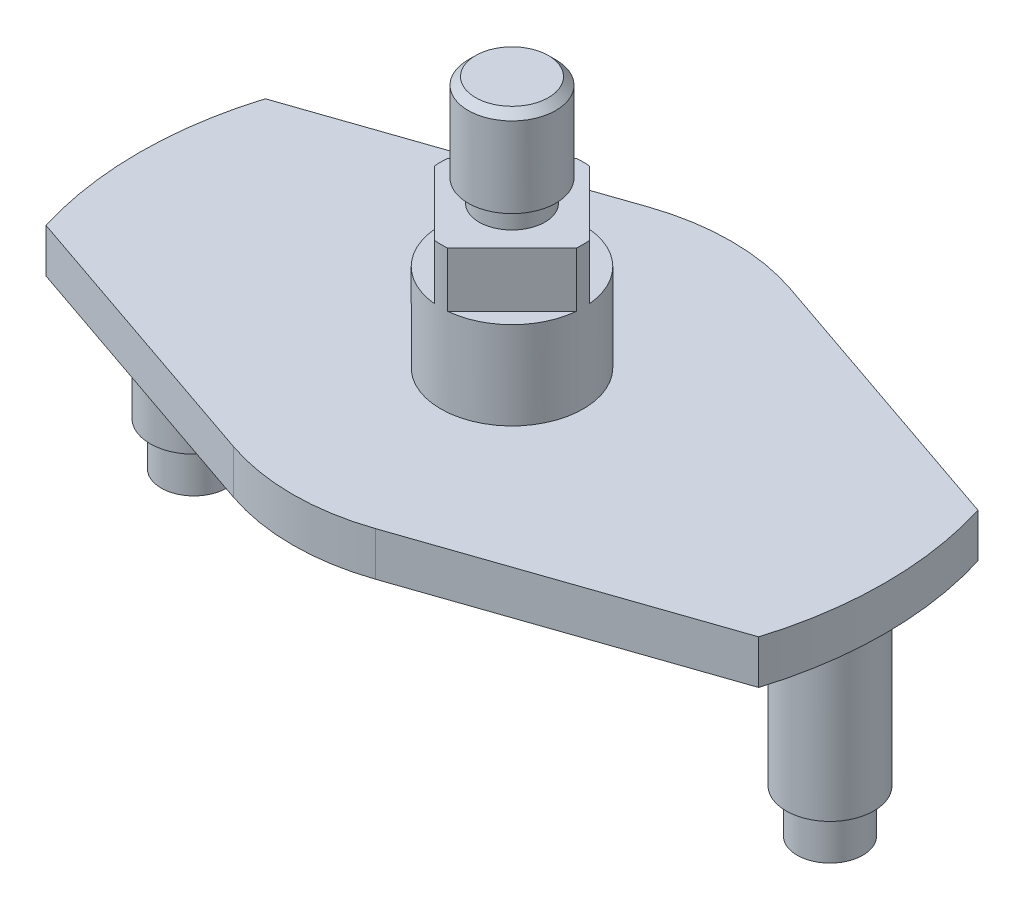
ISO-10303-21;
HEADER;
FILE_DESCRIPTION(('STEP AP214'),'2;1');
FILE_NAME('part.step','',(''),(''),'','','');
FILE_SCHEMA(('AUTOMOTIVE_DESIGN { 1 0 10303 214 1 1 1 1 }'));
ENDSEC;
DATA;
#1=APPLICATION_CONTEXT('core data for automotive mechanical design processes');
#2=APPLICATION_PROTOCOL_DEFINITION('international standard','automotive_design',2000,#1);
#3=PRODUCT_CONTEXT('',#1,'mechanical');
#4=PRODUCT('Part','Part','',(#3));
#5=PRODUCT_RELATED_PRODUCT_CATEGORY('part','',(#4));
#6=PRODUCT_DEFINITION_FORMATION('','',#4);
#7=PRODUCT_DEFINITION_CONTEXT('part definition',#1,'design');
#8=PRODUCT_DEFINITION('design','',#6,#7);
#9=PRODUCT_DEFINITION_SHAPE('','',#8);
#10=(LENGTH_UNIT() NAMED_UNIT(*) SI_UNIT(.MILLI.,.METRE.));
#11=(NAMED_UNIT(*) PLANE_ANGLE_UNIT() SI_UNIT($,.RADIAN.));
#12=(NAMED_UNIT(*) SI_UNIT($,.STERADIAN.) SOLID_ANGLE_UNIT());
#13=UNCERTAINTY_MEASURE_WITH_UNIT(LENGTH_MEASURE(1.E-05),#10,'distance_accuracy_value','');
#14=(GEOMETRIC_REPRESENTATION_CONTEXT(3) GLOBAL_UNCERTAINTY_ASSIGNED_CONTEXT((#13)) GLOBAL_UNIT_ASSIGNED_CONTEXT((#10,
#11,#12)) REPRESENTATION_CONTEXT('',''));
#15=CARTESIAN_POINT('',(0.,0.,0.));
#16=DIRECTION('',(0.,0.,1.));
#17=DIRECTION('',(1.,0.,0.));
#18=AXIS2_PLACEMENT_3D('',#15,#16,#17);
#19=CARTESIAN_POINT('',(29.,-18.5,0.));
#20=DIRECTION('',(0.,1.,0.));
#21=DIRECTION('',(0.,0.,1.));
#22=AXIS2_PLACEMENT_3D('',#19,#20,#21);
#23=CYLINDRICAL_SURFACE('',#22,4.);
#24=CARTESIAN_POINT('',(29.,0.,0.));
#25=DIRECTION('',(0.,1.,0.));
#26=DIRECTION('',(0.,0.,1.));
#27=AXIS2_PLACEMENT_3D('',#24,#25,#26);
#28=CIRCLE('',#27,4.);
#29=CARTESIAN_POINT('',(29.,0.,4.));
#30=VERTEX_POINT('',#29);
#31=EDGE_CURVE('E56',#30,#30,#28,.F.);
#32=ORIENTED_EDGE('',*,*,#31,.T.);
#33=EDGE_LOOP('',(#32));
#34=FACE_BOUND('',#33,.T.);
#35=CARTESIAN_POINT('',(29.,-14.5,0.));
#36=DIRECTION('',(0.,-1.,0.));
#37=DIRECTION('',(0.,0.,-1.));
#38=AXIS2_PLACEMENT_3D('',#35,#36,#37);
#39=CIRCLE('',#38,4.);
#40=CARTESIAN_POINT('',(29.,-14.5,-4.));
#41=VERTEX_POINT('',#40);
#42=EDGE_CURVE('E314',#41,#41,#39,.T.);
#43=ORIENTED_EDGE('',*,*,#42,.F.);
#44=EDGE_LOOP('',(#43));
#45=FACE_BOUND('',#44,.T.);
#46=ADVANCED_FACE('F48',(#34,#45),#23,.T.);
#47=CARTESIAN_POINT('',(0.,17.,0.));
#48=DIRECTION('',(0.,-1.,0.));
#49=DIRECTION('',(0.,0.,-1.));
#50=AXIS2_PLACEMENT_3D('',#47,#48,#49);
#51=CYLINDRICAL_SURFACE('',#50,6.5);
#52=CARTESIAN_POINT('',(0.,4.,0.));
#53=DIRECTION('',(0.,1.,0.));
#54=DIRECTION('',(0.,0.,1.));
#55=AXIS2_PLACEMENT_3D('',#52,#53,#54);
#56=CIRCLE('',#55,6.5);
#57=CARTESIAN_POINT('',(0.,4.,6.5));
#58=VERTEX_POINT('',#57);
#59=EDGE_CURVE('E190',#58,#58,#56,.T.);
#60=ORIENTED_EDGE('',*,*,#59,.T.);
#61=EDGE_LOOP('',(#60));
#62=FACE_BOUND('',#61,.T.);
#63=DIRECTION('',(0.,-1.,0.));
#64=VECTOR('',#63,1.);
#65=CARTESIAN_POINT('',(-6.47236893705042,17.,0.598698874815058));
#66=LINE('',#65,#64);
#67=CARTESIAN_POINT('',(-6.47236893705042,17.,0.598698874815055));
#68=VERTEX_POINT('',#67);
#69=CARTESIAN_POINT('',(-6.47236893705042,12.,0.598698874815055));
#70=VERTEX_POINT('',#69);
#71=EDGE_CURVE('E215',#68,#70,#66,.T.);
#72=ORIENTED_EDGE('',*,*,#71,.F.);
#73=CARTESIAN_POINT('',(0.,17.,0.));
#74=DIRECTION('',(0.,1.,0.));
#75=DIRECTION('',(0.,0.,1.));
#76=AXIS2_PLACEMENT_3D('',#73,#74,#75);
#77=CIRCLE('',#76,6.5);
#78=CARTESIAN_POINT('',(-6.47236893705042,17.,-0.598698874815054));
#79=VERTEX_POINT('',#78);
#80=EDGE_CURVE('E189',#79,#68,#77,.T.);
#81=ORIENTED_EDGE('',*,*,#80,.F.);
#82=DIRECTION('',(0.,-1.,0.));
#83=VECTOR('',#82,1.);
#84=CARTESIAN_POINT('',(-6.47236893705042,17.,-0.598698874815055));
#85=LINE('',#84,#83);
#86=CARTESIAN_POINT('',(-6.47236893705042,12.,-0.598698874815055));
#87=VERTEX_POINT('',#86);
#88=EDGE_CURVE('E71',#87,#79,#85,.F.);
#89=ORIENTED_EDGE('',*,*,#88,.F.);
#90=CARTESIAN_POINT('',(0.,12.,0.));
#91=DIRECTION('',(0.,1.,0.));
#92=DIRECTION('',(0.,0.,1.));
#93=AXIS2_PLACEMENT_3D('',#90,#91,#92);
#94=CIRCLE('',#93,6.5);
#95=CARTESIAN_POINT('',(-0.598698874815049,12.,-6.47236893705042));
#96=VERTEX_POINT('',#95);
#97=EDGE_CURVE('E212',#96,#87,#94,.T.);
#98=ORIENTED_EDGE('',*,*,#97,.F.);
#99=DIRECTION('',(0.,-1.,0.));
#100=VECTOR('',#99,1.);
#101=CARTESIAN_POINT('',(-0.598698874815049,17.,-6.47236893705042));
#102=LINE('',#101,#100);
#103=CARTESIAN_POINT('',(-0.598698874815048,17.,-6.47236893705042));
#104=VERTEX_POINT('',#103);
#105=EDGE_CURVE('E211',#104,#96,#102,.T.);
#106=ORIENTED_EDGE('',*,*,#105,.F.);
#107=CARTESIAN_POINT('',(0.598698874815054,17.,-6.47236893705042));
#108=VERTEX_POINT('',#107);
#109=EDGE_CURVE('E193',#108,#104,#77,.T.);
#110=ORIENTED_EDGE('',*,*,#109,.F.);
#111=DIRECTION('',(0.,-1.,0.));
#112=VECTOR('',#111,1.);
#113=CARTESIAN_POINT('',(0.598698874815054,17.,-6.47236893705042));
#114=LINE('',#113,#112);
#115=CARTESIAN_POINT('',(0.598698874815055,12.,-6.47236893705042));
#116=VERTEX_POINT('',#115);
#117=EDGE_CURVE('E184',#116,#108,#114,.F.);
#118=ORIENTED_EDGE('',*,*,#117,.F.);
#119=CARTESIAN_POINT('',(6.47236893705042,12.,-0.598698874815055));
#120=VERTEX_POINT('',#119);
#121=EDGE_CURVE('E312',#120,#116,#94,.T.);
#122=ORIENTED_EDGE('',*,*,#121,.F.);
#123=DIRECTION('',(0.,-1.,0.));
#124=VECTOR('',#123,1.);
#125=CARTESIAN_POINT('',(6.47236893705042,17.,-0.598698874815055));
#126=LINE('',#125,#124);
#127=CARTESIAN_POINT('',(6.47236893705042,17.,-0.598698874815054));
#128=VERTEX_POINT('',#127);
#129=EDGE_CURVE('E217',#128,#120,#126,.T.);
#130=ORIENTED_EDGE('',*,*,#129,.F.);
#131=CARTESIAN_POINT('',(6.47236893705042,17.,0.59869887481506));
#132=VERTEX_POINT('',#131);
#133=EDGE_CURVE('E192',#132,#128,#77,.T.);
#134=ORIENTED_EDGE('',*,*,#133,.F.);
#135=DIRECTION('',(0.,-1.,0.));
#136=VECTOR('',#135,1.);
#137=CARTESIAN_POINT('',(6.47236893705042,17.,0.598698874815059));
#138=LINE('',#137,#136);
#139=CARTESIAN_POINT('',(6.47236893705042,12.,0.598698874815059));
#140=VERTEX_POINT('',#139);
#141=EDGE_CURVE('E169',#140,#132,#138,.F.);
#142=ORIENTED_EDGE('',*,*,#141,.F.);
#143=CARTESIAN_POINT('',(0.598698874815056,12.,6.47236893705042));
#144=VERTEX_POINT('',#143);
#145=EDGE_CURVE('E183',#144,#140,#94,.T.);
#146=ORIENTED_EDGE('',*,*,#145,.F.);
#147=DIRECTION('',(0.,-1.,0.));
#148=VECTOR('',#147,1.);
#149=CARTESIAN_POINT('',(0.598698874815056,17.,6.47236893705042));
#150=LINE('',#149,#148);
#151=CARTESIAN_POINT('',(0.598698874815057,17.,6.47236893705042));
#152=VERTEX_POINT('',#151);
#153=EDGE_CURVE('E166',#152,#144,#150,.T.);
#154=ORIENTED_EDGE('',*,*,#153,.F.);
#155=CARTESIAN_POINT('',(-0.598698874815059,17.,6.47236893705042));
#156=VERTEX_POINT('',#155);
#157=EDGE_CURVE('E182',#156,#152,#77,.T.);
#158=ORIENTED_EDGE('',*,*,#157,.F.);
#159=DIRECTION('',(0.,-1.,0.));
#160=VECTOR('',#159,1.);
#161=CARTESIAN_POINT('',(-0.59869887481506,17.,6.47236893705042));
#162=LINE('',#161,#160);
#163=CARTESIAN_POINT('',(-0.598698874815059,12.,6.47236893705042));
#164=VERTEX_POINT('',#163);
#165=EDGE_CURVE('E63',#164,#156,#162,.F.);
#166=ORIENTED_EDGE('',*,*,#165,.F.);
#167=EDGE_CURVE('E313',#70,#164,#94,.T.);
#168=ORIENTED_EDGE('',*,*,#167,.F.);
#169=EDGE_LOOP('',(#72,#81,#89,#98,#106,#110,#118,#122,#130,#134,#142,#146,#154,#158,#166,#168));
#170=FACE_BOUND('',#169,.T.);
#171=ADVANCED_FACE('F181',(#62,#170),#51,.T.);
#172=CARTESIAN_POINT('',(0.,17.,0.));
#173=DIRECTION('',(0.,1.,0.));
#174=DIRECTION('',(0.,0.,1.));
#175=AXIS2_PLACEMENT_3D('',#172,#173,#174);
#176=PLANE('',#175);
#177=CARTESIAN_POINT('',(0.,17.,0.));
#178=DIRECTION('',(0.,1.,0.));
#179=DIRECTION('',(0.,0.,1.));
#180=AXIS2_PLACEMENT_3D('',#177,#178,#179);
#181=CIRCLE('',#180,3.);
#182=CARTESIAN_POINT('',(0.,17.,3.));
#183=VERTEX_POINT('',#182);
#184=EDGE_CURVE('E228',#183,#183,#181,.T.);
#185=ORIENTED_EDGE('',*,*,#184,.F.);
#186=EDGE_LOOP('',(#185));
#187=FACE_BOUND('',#186,.T.);
#188=ORIENTED_EDGE('',*,*,#80,.T.);
#189=DIRECTION('',(0.707106781186547,0.,0.707106781186548));
#190=VECTOR('',#189,1.);
#191=CARTESIAN_POINT('',(-3.53553390593274,17.,3.53553390593274));
#192=LINE('',#191,#190);
#193=EDGE_CURVE('E188',#68,#156,#192,.T.);
#194=ORIENTED_EDGE('',*,*,#193,.T.);
#195=ORIENTED_EDGE('',*,*,#157,.T.);
#196=DIRECTION('',(0.707106781186548,0.,-0.707106781186547));
#197=VECTOR('',#196,1.);
#198=CARTESIAN_POINT('',(3.53553390593274,17.,3.53553390593274));
#199=LINE('',#198,#197);
#200=EDGE_CURVE('E162',#152,#132,#199,.T.);
#201=ORIENTED_EDGE('',*,*,#200,.T.);
#202=ORIENTED_EDGE('',*,*,#133,.T.);
#203=DIRECTION('',(-0.707106781186548,0.,-0.707106781186547));
#204=VECTOR('',#203,1.);
#205=CARTESIAN_POINT('',(3.53553390593274,17.,-3.53553390593274));
#206=LINE('',#205,#204);
#207=EDGE_CURVE('E174',#128,#108,#206,.T.);
#208=ORIENTED_EDGE('',*,*,#207,.T.);
#209=ORIENTED_EDGE('',*,*,#109,.T.);
#210=DIRECTION('',(-0.707106781186548,0.,0.707106781186547));
#211=VECTOR('',#210,1.);
#212=CARTESIAN_POINT('',(-3.53553390593273,17.,-3.53553390593274));
#213=LINE('',#212,#211);
#214=EDGE_CURVE('E205',#104,#79,#213,.T.);
#215=ORIENTED_EDGE('',*,*,#214,.T.);
#216=EDGE_LOOP('',(#188,#194,#195,#201,#202,#208,#209,#215));
#217=FACE_BOUND('',#216,.T.);
#218=ADVANCED_FACE('F187',(#187,#217),#176,.T.);
#219=CARTESIAN_POINT('',(-6.48734482134129,4.,18.9186246109229));
#220=DIRECTION('',(0.324367241067065,0.,-0.945931230546143));
#221=DIRECTION('',(-0.945931230546143,0.,-0.324367241067065));
#222=AXIS2_PLACEMENT_3D('',#219,#220,#221);
#223=PLANE('',#222);
#224=DIRECTION('',(0.945931230546143,0.,0.324367241067065));
#225=VECTOR('',#224,1.);
#226=CARTESIAN_POINT('',(-6.48734482134129,0.,18.9186246109229));
#227=LINE('',#226,#225);
#228=CARTESIAN_POINT('',(-32.4961536185438,0.,10.));
#229=VERTEX_POINT('',#228);
#230=CARTESIAN_POINT('',(-6.48734482134129,0.,18.9186246109229));
#231=VERTEX_POINT('',#230);
#232=EDGE_CURVE('E198',#229,#231,#227,.T.);
#233=ORIENTED_EDGE('',*,*,#232,.T.);
#234=DIRECTION('',(0.,-1.,0.));
#235=VECTOR('',#234,1.);
#236=CARTESIAN_POINT('',(-6.48734482134129,4.,18.9186246109229));
#237=LINE('',#236,#235);
#238=CARTESIAN_POINT('',(-6.48734482134129,4.,18.9186246109229));
#239=VERTEX_POINT('',#238);
#240=EDGE_CURVE('E175',#239,#231,#237,.T.);
#241=ORIENTED_EDGE('',*,*,#240,.F.);
#242=DIRECTION('',(0.945931230546143,0.,0.324367241067065));
#243=VECTOR('',#242,1.);
#244=CARTESIAN_POINT('',(-6.48734482134129,4.,18.9186246109229));
#245=LINE('',#244,#243);
#246=CARTESIAN_POINT('',(-32.4961536185438,4.,10.));
#247=VERTEX_POINT('',#246);
#248=EDGE_CURVE('E482',#247,#239,#245,.T.);
#249=ORIENTED_EDGE('',*,*,#248,.F.);
#250=DIRECTION('',(0.,-1.,0.));
#251=VECTOR('',#250,1.);
#252=CARTESIAN_POINT('',(-32.4961536185438,4.,10.));
#253=LINE('',#252,#251);
#254=EDGE_CURVE('E480',#247,#229,#253,.T.);
#255=ORIENTED_EDGE('',*,*,#254,.T.);
#256=EDGE_LOOP('',(#233,#241,#249,#255));
#257=FACE_BOUND('',#256,.T.);
#258=ADVANCED_FACE('F50',(#257),#223,.F.);
#259=CARTESIAN_POINT('',(0.,4.,0.));
#260=DIRECTION('',(0.,-1.,0.));
#261=DIRECTION('',(0.,0.,-1.));
#262=AXIS2_PLACEMENT_3D('',#259,#260,#261);
#263=CYLINDRICAL_SURFACE('',#262,20.);
#264=CARTESIAN_POINT('',(0.,0.,0.));
#265=DIRECTION('',(0.,1.,0.));
#266=DIRECTION('',(0.,0.,1.));
#267=AXIS2_PLACEMENT_3D('',#264,#265,#266);
#268=CIRCLE('',#267,20.);
#269=CARTESIAN_POINT('',(6.48734482134129,0.,18.9186246109229));
#270=VERTEX_POINT('',#269);
#271=EDGE_CURVE('E201',#231,#270,#268,.T.);
#272=ORIENTED_EDGE('',*,*,#271,.T.);
#273=DIRECTION('',(0.,-1.,0.));
#274=VECTOR('',#273,1.);
#275=CARTESIAN_POINT('',(6.48734482134129,4.,18.9186246109229));
#276=LINE('',#275,#274);
#277=CARTESIAN_POINT('',(6.48734482134129,4.,18.9186246109229));
#278=VERTEX_POINT('',#277);
#279=EDGE_CURVE('E504',#278,#270,#276,.T.);
#280=ORIENTED_EDGE('',*,*,#279,.F.);
#281=CARTESIAN_POINT('',(0.,4.,0.));
#282=DIRECTION('',(0.,1.,0.));
#283=DIRECTION('',(0.,0.,1.));
#284=AXIS2_PLACEMENT_3D('',#281,#282,#283);
#285=CIRCLE('',#284,20.);
#286=EDGE_CURVE('E510',#239,#278,#285,.T.);
#287=ORIENTED_EDGE('',*,*,#286,.F.);
#288=ORIENTED_EDGE('',*,*,#240,.T.);
#289=EDGE_LOOP('',(#272,#280,#287,#288));
#290=FACE_BOUND('',#289,.T.);
#291=ADVANCED_FACE('F243',(#290),#263,.T.);
#292=CARTESIAN_POINT('',(6.48734482134129,4.,18.9186246109229));
#293=DIRECTION('',(0.324367241067065,0.,0.945931230546143));
#294=DIRECTION('',(0.945931230546143,0.,-0.324367241067065));
#295=AXIS2_PLACEMENT_3D('',#292,#293,#294);
#296=PLANE('',#295);
#297=DIRECTION('',(-0.945931230546143,0.,0.324367241067065));
#298=VECTOR('',#297,1.);
#299=CARTESIAN_POINT('',(6.48734482134129,0.,18.9186246109229));
#300=LINE('',#299,#298);
#301=CARTESIAN_POINT('',(32.4961536185438,0.,10.));
#302=VERTEX_POINT('',#301);
#303=EDGE_CURVE('E529',#302,#270,#300,.T.);
#304=ORIENTED_EDGE('',*,*,#303,.F.);
#305=DIRECTION('',(0.,-1.,0.));
#306=VECTOR('',#305,1.);
#307=CARTESIAN_POINT('',(32.4961536185438,4.,10.));
#308=LINE('',#307,#306);
#309=CARTESIAN_POINT('',(32.4961536185438,4.,10.));
#310=VERTEX_POINT('',#309);
#311=EDGE_CURVE('E503',#310,#302,#308,.T.);
#312=ORIENTED_EDGE('',*,*,#311,.F.);
#313=DIRECTION('',(-0.945931230546143,0.,0.324367241067065));
#314=VECTOR('',#313,1.);
#315=CARTESIAN_POINT('',(6.48734482134129,4.,18.9186246109229));
#316=LINE('',#315,#314);
#317=EDGE_CURVE('E513',#310,#278,#316,.T.);
#318=ORIENTED_EDGE('',*,*,#317,.T.);
#319=ORIENTED_EDGE('',*,*,#279,.T.);
#320=EDGE_LOOP('',(#304,#312,#318,#319));
#321=FACE_BOUND('',#320,.T.);
#322=ADVANCED_FACE('F549',(#321),#296,.T.);
#323=CARTESIAN_POINT('',(0.,4.,0.));
#324=DIRECTION('',(0.,-1.,0.));
#325=DIRECTION('',(0.,0.,-1.));
#326=AXIS2_PLACEMENT_3D('',#323,#324,#325);
#327=CYLINDRICAL_SURFACE('',#326,34.);
#328=CARTESIAN_POINT('',(0.,0.,0.));
#329=DIRECTION('',(0.,1.,0.));
#330=DIRECTION('',(0.,0.,1.));
#331=AXIS2_PLACEMENT_3D('',#328,#329,#330);
#332=CIRCLE('',#331,34.);
#333=CARTESIAN_POINT('',(32.4961536185438,0.,-10.));
#334=VERTEX_POINT('',#333);
#335=EDGE_CURVE('E518',#302,#334,#332,.T.);
#336=ORIENTED_EDGE('',*,*,#335,.T.);
#337=DIRECTION('',(0.,-1.,0.));
#338=VECTOR('',#337,1.);
#339=CARTESIAN_POINT('',(32.4961536185438,4.,-10.));
#340=LINE('',#339,#338);
#341=CARTESIAN_POINT('',(32.4961536185438,4.,-10.));
#342=VERTEX_POINT('',#341);
#343=EDGE_CURVE('E500',#342,#334,#340,.T.);
#344=ORIENTED_EDGE('',*,*,#343,.F.);
#345=CARTESIAN_POINT('',(0.,4.,0.));
#346=DIRECTION('',(0.,1.,0.));
#347=DIRECTION('',(0.,0.,1.));
#348=AXIS2_PLACEMENT_3D('',#345,#346,#347);
#349=CIRCLE('',#348,34.);
#350=EDGE_CURVE('E492',#310,#342,#349,.T.);
#351=ORIENTED_EDGE('',*,*,#350,.F.);
#352=ORIENTED_EDGE('',*,*,#311,.T.);
#353=EDGE_LOOP('',(#336,#344,#351,#352));
#354=FACE_BOUND('',#353,.T.);
#355=ADVANCED_FACE('F551',(#354),#327,.T.);
#356=CARTESIAN_POINT('',(6.48734482134129,4.,-18.9186246109229));
#357=DIRECTION('',(-0.324367241067065,0.,0.945931230546143));
#358=DIRECTION('',(0.945931230546143,0.,0.324367241067065));
#359=AXIS2_PLACEMENT_3D('',#356,#357,#358);
#360=PLANE('',#359);
#361=DIRECTION('',(-0.945931230546143,0.,-0.324367241067065));
#362=VECTOR('',#361,1.);
#363=CARTESIAN_POINT('',(6.48734482134129,0.,-18.9186246109229));
#364=LINE('',#363,#362);
#365=CARTESIAN_POINT('',(6.48734482134129,0.,-18.9186246109229));
#366=VERTEX_POINT('',#365);
#367=EDGE_CURVE('E531',#334,#366,#364,.T.);
#368=ORIENTED_EDGE('',*,*,#367,.T.);
#369=DIRECTION('',(0.,-1.,0.));
#370=VECTOR('',#369,1.);
#371=CARTESIAN_POINT('',(6.48734482134129,4.,-18.9186246109229));
#372=LINE('',#371,#370);
#373=CARTESIAN_POINT('',(6.48734482134129,4.,-18.9186246109229));
#374=VERTEX_POINT('',#373);
#375=EDGE_CURVE('E498',#374,#366,#372,.T.);
#376=ORIENTED_EDGE('',*,*,#375,.F.);
#377=DIRECTION('',(-0.945931230546143,0.,-0.324367241067065));
#378=VECTOR('',#377,1.);
#379=CARTESIAN_POINT('',(6.48734482134129,4.,-18.9186246109229));
#380=LINE('',#379,#378);
#381=EDGE_CURVE('E521',#342,#374,#380,.T.);
#382=ORIENTED_EDGE('',*,*,#381,.F.);
#383=ORIENTED_EDGE('',*,*,#343,.T.);
#384=EDGE_LOOP('',(#368,#376,#382,#383));
#385=FACE_BOUND('',#384,.T.);
#386=ADVANCED_FACE('F545',(#385),#360,.F.);
#387=CARTESIAN_POINT('',(0.,4.,0.));
#388=DIRECTION('',(0.,-1.,0.));
#389=DIRECTION('',(0.,0.,-1.));
#390=AXIS2_PLACEMENT_3D('',#387,#388,#389);
#391=CYLINDRICAL_SURFACE('',#390,20.);
#392=CARTESIAN_POINT('',(0.,0.,0.));
#393=DIRECTION('',(0.,1.,0.));
#394=DIRECTION('',(0.,0.,1.));
#395=AXIS2_PLACEMENT_3D('',#392,#393,#394);
#396=CIRCLE('',#395,20.);
#397=CARTESIAN_POINT('',(-6.48734482134129,0.,-18.9186246109229));
#398=VERTEX_POINT('',#397);
#399=EDGE_CURVE('E533',#398,#366,#396,.F.);
#400=ORIENTED_EDGE('',*,*,#399,.F.);
#401=DIRECTION('',(0.,-1.,0.));
#402=VECTOR('',#401,1.);
#403=CARTESIAN_POINT('',(-6.48734482134129,4.,-18.9186246109229));
#404=LINE('',#403,#402);
#405=CARTESIAN_POINT('',(-6.48734482134129,4.,-18.9186246109229));
#406=VERTEX_POINT('',#405);
#407=EDGE_CURVE('E488',#406,#398,#404,.T.);
#408=ORIENTED_EDGE('',*,*,#407,.F.);
#409=CARTESIAN_POINT('',(0.,4.,0.));
#410=DIRECTION('',(0.,1.,0.));
#411=DIRECTION('',(0.,0.,1.));
#412=AXIS2_PLACEMENT_3D('',#409,#410,#411);
#413=CIRCLE('',#412,20.);
#414=EDGE_CURVE('E523',#406,#374,#413,.F.);
#415=ORIENTED_EDGE('',*,*,#414,.T.);
#416=ORIENTED_EDGE('',*,*,#375,.T.);
#417=EDGE_LOOP('',(#400,#408,#415,#416));
#418=FACE_BOUND('',#417,.T.);
#419=ADVANCED_FACE('F541',(#418),#391,.T.);
#420=CARTESIAN_POINT('',(-6.48734482134129,4.,-18.9186246109229));
#421=DIRECTION('',(-0.324367241067065,0.,-0.945931230546143));
#422=DIRECTION('',(-0.945931230546143,0.,0.324367241067065));
#423=AXIS2_PLACEMENT_3D('',#420,#421,#422);
#424=PLANE('',#423);
#425=DIRECTION('',(0.945931230546143,0.,-0.324367241067065));
#426=VECTOR('',#425,1.);
#427=CARTESIAN_POINT('',(-6.48734482134129,0.,-18.9186246109229));
#428=LINE('',#427,#426);
#429=CARTESIAN_POINT('',(-32.4961536185438,0.,-10.));
#430=VERTEX_POINT('',#429);
#431=EDGE_CURVE('E494',#430,#398,#428,.T.);
#432=ORIENTED_EDGE('',*,*,#431,.F.);
#433=DIRECTION('',(0.,-1.,0.));
#434=VECTOR('',#433,1.);
#435=CARTESIAN_POINT('',(-32.4961536185438,4.,-10.));
#436=LINE('',#435,#434);
#437=CARTESIAN_POINT('',(-32.4961536185438,4.,-10.));
#438=VERTEX_POINT('',#437);
#439=EDGE_CURVE('E485',#438,#430,#436,.T.);
#440=ORIENTED_EDGE('',*,*,#439,.F.);
#441=DIRECTION('',(0.945931230546143,0.,-0.324367241067065));
#442=VECTOR('',#441,1.);
#443=CARTESIAN_POINT('',(-6.48734482134129,4.,-18.9186246109229));
#444=LINE('',#443,#442);
#445=EDGE_CURVE('E490',#438,#406,#444,.T.);
#446=ORIENTED_EDGE('',*,*,#445,.T.);
#447=ORIENTED_EDGE('',*,*,#407,.T.);
#448=EDGE_LOOP('',(#432,#440,#446,#447));
#449=FACE_BOUND('',#448,.T.);
#450=ADVANCED_FACE('F538',(#449),#424,.T.);
#451=EDGE_CURVE('E471',#430,#229,#332,.T.);
#452=ORIENTED_EDGE('',*,*,#451,.T.);
#453=ORIENTED_EDGE('',*,*,#254,.F.);
#454=EDGE_CURVE('E486',#438,#247,#349,.T.);
#455=ORIENTED_EDGE('',*,*,#454,.F.);
#456=ORIENTED_EDGE('',*,*,#439,.T.);
#457=EDGE_LOOP('',(#452,#453,#455,#456));
#458=FACE_BOUND('',#457,.T.);
#459=ADVANCED_FACE('F554',(#458),#327,.T.);
#460=CARTESIAN_POINT('',(0.,4.,0.));
#461=DIRECTION('',(0.,1.,0.));
#462=DIRECTION('',(0.,0.,1.));
#463=AXIS2_PLACEMENT_3D('',#460,#461,#462);
#464=PLANE('',#463);
#465=ORIENTED_EDGE('',*,*,#59,.F.);
#466=EDGE_LOOP('',(#465));
#467=FACE_BOUND('',#466,.T.);
#468=ORIENTED_EDGE('',*,*,#248,.T.);
#469=ORIENTED_EDGE('',*,*,#286,.T.);
#470=ORIENTED_EDGE('',*,*,#317,.F.);
#471=ORIENTED_EDGE('',*,*,#350,.T.);
#472=ORIENTED_EDGE('',*,*,#381,.T.);
#473=ORIENTED_EDGE('',*,*,#414,.F.);
#474=ORIENTED_EDGE('',*,*,#445,.F.);
#475=ORIENTED_EDGE('',*,*,#454,.T.);
#476=EDGE_LOOP('',(#468,#469,#470,#471,#472,#473,#474,#475));
#477=FACE_BOUND('',#476,.T.);
#478=ADVANCED_FACE('F464',(#467,#477),#464,.T.);
#479=CARTESIAN_POINT('',(0.,0.,0.));
#480=DIRECTION('',(0.,1.,0.));
#481=DIRECTION('',(0.,0.,1.));
#482=AXIS2_PLACEMENT_3D('',#479,#480,#481);
#483=PLANE('',#482);
#484=CARTESIAN_POINT('',(-29.,0.,0.));
#485=DIRECTION('',(0.,1.,0.));
#486=DIRECTION('',(0.,0.,1.));
#487=AXIS2_PLACEMENT_3D('',#484,#485,#486);
#488=CIRCLE('',#487,4.);
#489=CARTESIAN_POINT('',(-29.,0.,4.));
#490=VERTEX_POINT('',#489);
#491=EDGE_CURVE('E12',#490,#490,#488,.F.);
#492=ORIENTED_EDGE('',*,*,#491,.F.);
#493=EDGE_LOOP('',(#492));
#494=FACE_BOUND('',#493,.T.);
#495=ORIENTED_EDGE('',*,*,#31,.F.);
#496=EDGE_LOOP('',(#495));
#497=FACE_BOUND('',#496,.T.);
#498=ORIENTED_EDGE('',*,*,#232,.F.);
#499=ORIENTED_EDGE('',*,*,#451,.F.);
#500=ORIENTED_EDGE('',*,*,#431,.T.);
#501=ORIENTED_EDGE('',*,*,#399,.T.);
#502=ORIENTED_EDGE('',*,*,#367,.F.);
#503=ORIENTED_EDGE('',*,*,#335,.F.);
#504=ORIENTED_EDGE('',*,*,#303,.T.);
#505=ORIENTED_EDGE('',*,*,#271,.F.);
#506=EDGE_LOOP('',(#498,#499,#500,#501,#502,#503,#504,#505));
#507=FACE_BOUND('',#506,.T.);
#508=ADVANCED_FACE('F291',(#494,#497,#507),#483,.F.);
#509=CARTESIAN_POINT('',(0.,19.,0.));
#510=DIRECTION('',(0.,1.,0.));
#511=DIRECTION('',(0.,0.,1.));
#512=AXIS2_PLACEMENT_3D('',#509,#510,#511);
#513=PLANE('',#512);
#514=CARTESIAN_POINT('',(0.,19.,0.));
#515=DIRECTION('',(0.,1.,0.));
#516=DIRECTION('',(0.,0.,1.));
#517=AXIS2_PLACEMENT_3D('',#514,#515,#516);
#518=CIRCLE('',#517,3.);
#519=CARTESIAN_POINT('',(0.,19.,3.));
#520=VERTEX_POINT('',#519);
#521=EDGE_CURVE('E229',#520,#520,#518,.T.);
#522=ORIENTED_EDGE('',*,*,#521,.T.);
#523=EDGE_LOOP('',(#522));
#524=FACE_BOUND('',#523,.T.);
#525=CARTESIAN_POINT('',(0.,19.,0.));
#526=DIRECTION('',(0.,1.,0.));
#527=DIRECTION('',(0.,0.,1.));
#528=AXIS2_PLACEMENT_3D('',#525,#526,#527);
#529=CIRCLE('',#528,4.);
#530=CARTESIAN_POINT('',(0.,19.,4.));
#531=VERTEX_POINT('',#530);
#532=EDGE_CURVE('E195',#531,#531,#529,.T.);
#533=ORIENTED_EDGE('',*,*,#532,.F.);
#534=EDGE_LOOP('',(#533));
#535=FACE_BOUND('',#534,.T.);
#536=ADVANCED_FACE('F287',(#524,#535),#513,.F.);
#537=CARTESIAN_POINT('',(0.,19.,0.));
#538=DIRECTION('',(0.,-1.,0.));
#539=DIRECTION('',(0.,0.,-1.));
#540=AXIS2_PLACEMENT_3D('',#537,#538,#539);
#541=CYLINDRICAL_SURFACE('',#540,3.);
#542=ORIENTED_EDGE('',*,*,#521,.F.);
#543=EDGE_LOOP('',(#542));
#544=FACE_BOUND('',#543,.T.);
#545=ORIENTED_EDGE('',*,*,#184,.T.);
#546=EDGE_LOOP('',(#545));
#547=FACE_BOUND('',#546,.T.);
#548=ADVANCED_FACE('F234',(#544,#547),#541,.T.);
#549=CARTESIAN_POINT('',(0.,27.,0.));
#550=DIRECTION('',(0.,-1.,0.));
#551=DIRECTION('',(0.,0.,-1.));
#552=AXIS2_PLACEMENT_3D('',#549,#550,#551);
#553=CYLINDRICAL_SURFACE('',#552,4.);
#554=CARTESIAN_POINT('',(0.,26.3235,0.));
#555=DIRECTION('',(0.,-1.,0.));
#556=DIRECTION('',(0.,0.,-1.));
#557=AXIS2_PLACEMENT_3D('',#554,#555,#556);
#558=CIRCLE('',#557,4.);
#559=CARTESIAN_POINT('',(0.,26.3235,-4.));
#560=VERTEX_POINT('',#559);
#561=EDGE_CURVE('E225',#560,#560,#558,.T.);
#562=ORIENTED_EDGE('',*,*,#561,.T.);
#563=EDGE_LOOP('',(#562));
#564=FACE_BOUND('',#563,.T.);
#565=ORIENTED_EDGE('',*,*,#532,.T.);
#566=EDGE_LOOP('',(#565));
#567=FACE_BOUND('',#566,.T.);
#568=ADVANCED_FACE('F283',(#564,#567),#553,.T.);
#569=CARTESIAN_POINT('',(0.,27.,0.));
#570=DIRECTION('',(0.,-1.,0.));
#571=DIRECTION('',(0.,0.,-1.));
#572=AXIS2_PLACEMENT_3D('',#569,#570,#571);
#573=CONICAL_SURFACE('',#572,3.3235,0.785398163397453);
#574=ORIENTED_EDGE('',*,*,#561,.F.);
#575=EDGE_LOOP('',(#574));
#576=FACE_BOUND('',#575,.T.);
#577=CARTESIAN_POINT('',(0.,27.,0.));
#578=DIRECTION('',(0.,-1.,0.));
#579=DIRECTION('',(0.,0.,-1.));
#580=AXIS2_PLACEMENT_3D('',#577,#578,#579);
#581=CIRCLE('',#580,3.3235);
#582=CARTESIAN_POINT('',(0.,27.,-3.3235));
#583=VERTEX_POINT('',#582);
#584=EDGE_CURVE('E222',#583,#583,#581,.T.);
#585=ORIENTED_EDGE('',*,*,#584,.T.);
#586=EDGE_LOOP('',(#585));
#587=FACE_BOUND('',#586,.T.);
#588=ADVANCED_FACE('F280',(#576,#587),#573,.T.);
#589=CARTESIAN_POINT('',(0.,27.,0.));
#590=DIRECTION('',(0.,1.,0.));
#591=DIRECTION('',(0.,0.,1.));
#592=AXIS2_PLACEMENT_3D('',#589,#590,#591);
#593=PLANE('',#592);
#594=ORIENTED_EDGE('',*,*,#584,.F.);
#595=EDGE_LOOP('',(#594));
#596=FACE_BOUND('',#595,.T.);
#597=ADVANCED_FACE('F272',(#596),#593,.T.);
#598=CARTESIAN_POINT('',(0.,12.,7.07106781186548));
#599=DIRECTION('',(0.707106781186547,0.,0.707106781186548));
#600=DIRECTION('',(0.707106781186548,0.,-0.707106781186547));
#601=AXIS2_PLACEMENT_3D('',#598,#599,#600);
#602=PLANE('',#601);
#603=ORIENTED_EDGE('',*,*,#153,.T.);
#604=DIRECTION('',(0.707106781186548,0.,-0.707106781186547));
#605=VECTOR('',#604,1.);
#606=CARTESIAN_POINT('',(0.,12.,7.07106781186548));
#607=LINE('',#606,#605);
#608=EDGE_CURVE('E320',#144,#140,#607,.T.);
#609=ORIENTED_EDGE('',*,*,#608,.T.);
#610=ORIENTED_EDGE('',*,*,#141,.T.);
#611=ORIENTED_EDGE('',*,*,#200,.F.);
#612=EDGE_LOOP('',(#603,#609,#610,#611));
#613=FACE_BOUND('',#612,.T.);
#614=ADVANCED_FACE('F164',(#613),#602,.T.);
#615=CARTESIAN_POINT('',(0.,12.,0.));
#616=DIRECTION('',(0.,1.,0.));
#617=DIRECTION('',(0.,0.,1.));
#618=AXIS2_PLACEMENT_3D('',#615,#616,#617);
#619=PLANE('',#618);
#620=ORIENTED_EDGE('',*,*,#145,.T.);
#621=ORIENTED_EDGE('',*,*,#608,.F.);
#622=EDGE_LOOP('',(#620,#621));
#623=FACE_BOUND('',#622,.T.);
#624=ADVANCED_FACE('F269',(#623),#619,.T.);
#625=CARTESIAN_POINT('',(7.07106781186548,12.,0.));
#626=DIRECTION('',(0.707106781186547,0.,-0.707106781186548));
#627=DIRECTION('',(-0.707106781186548,0.,-0.707106781186547));
#628=AXIS2_PLACEMENT_3D('',#625,#626,#627);
#629=PLANE('',#628);
#630=ORIENTED_EDGE('',*,*,#129,.T.);
#631=DIRECTION('',(-0.707106781186548,0.,-0.707106781186547));
#632=VECTOR('',#631,1.);
#633=CARTESIAN_POINT('',(7.07106781186548,12.,0.));
#634=LINE('',#633,#632);
#635=EDGE_CURVE('E334',#120,#116,#634,.T.);
#636=ORIENTED_EDGE('',*,*,#635,.T.);
#637=ORIENTED_EDGE('',*,*,#117,.T.);
#638=ORIENTED_EDGE('',*,*,#207,.F.);
#639=EDGE_LOOP('',(#630,#636,#637,#638));
#640=FACE_BOUND('',#639,.T.);
#641=ADVANCED_FACE('F266',(#640),#629,.T.);
#642=ORIENTED_EDGE('',*,*,#121,.T.);
#643=ORIENTED_EDGE('',*,*,#635,.F.);
#644=EDGE_LOOP('',(#642,#643));
#645=FACE_BOUND('',#644,.T.);
#646=ADVANCED_FACE('F265',(#645),#619,.T.);
#647=CARTESIAN_POINT('',(-7.07106781186547,12.,0.));
#648=DIRECTION('',(-0.707106781186547,0.,-0.707106781186548));
#649=DIRECTION('',(-0.707106781186548,0.,0.707106781186547));
#650=AXIS2_PLACEMENT_3D('',#647,#648,#649);
#651=PLANE('',#650);
#652=ORIENTED_EDGE('',*,*,#105,.T.);
#653=DIRECTION('',(-0.707106781186548,0.,0.707106781186547));
#654=VECTOR('',#653,1.);
#655=CARTESIAN_POINT('',(-7.07106781186547,12.,0.));
#656=LINE('',#655,#654);
#657=EDGE_CURVE('E337',#96,#87,#656,.T.);
#658=ORIENTED_EDGE('',*,*,#657,.T.);
#659=ORIENTED_EDGE('',*,*,#88,.T.);
#660=ORIENTED_EDGE('',*,*,#214,.F.);
#661=EDGE_LOOP('',(#652,#658,#659,#660));
#662=FACE_BOUND('',#661,.T.);
#663=ADVANCED_FACE('F261',(#662),#651,.T.);
#664=ORIENTED_EDGE('',*,*,#97,.T.);
#665=ORIENTED_EDGE('',*,*,#657,.F.);
#666=EDGE_LOOP('',(#664,#665));
#667=FACE_BOUND('',#666,.T.);
#668=ADVANCED_FACE('F264',(#667),#619,.T.);
#669=ORIENTED_EDGE('',*,*,#167,.T.);
#670=DIRECTION('',(0.707106781186547,0.,0.707106781186548));
#671=VECTOR('',#670,1.);
#672=CARTESIAN_POINT('',(0.,12.,7.07106781186548));
#673=LINE('',#672,#671);
#674=EDGE_CURVE('E316',#70,#164,#673,.T.);
#675=ORIENTED_EDGE('',*,*,#674,.F.);
#676=EDGE_LOOP('',(#669,#675));
#677=FACE_BOUND('',#676,.T.);
#678=ADVANCED_FACE('F276',(#677),#619,.T.);
#679=CARTESIAN_POINT('',(0.,12.,7.07106781186548));
#680=DIRECTION('',(-0.707106781186548,0.,0.707106781186547));
#681=DIRECTION('',(0.707106781186547,0.,0.707106781186548));
#682=AXIS2_PLACEMENT_3D('',#679,#680,#681);
#683=PLANE('',#682);
#684=ORIENTED_EDGE('',*,*,#71,.T.);
#685=ORIENTED_EDGE('',*,*,#674,.T.);
#686=ORIENTED_EDGE('',*,*,#165,.T.);
#687=ORIENTED_EDGE('',*,*,#193,.F.);
#688=EDGE_LOOP('',(#684,#685,#686,#687));
#689=FACE_BOUND('',#688,.T.);
#690=ADVANCED_FACE('F273',(#689),#683,.T.);
#691=CARTESIAN_POINT('',(0.,-14.5,0.));
#692=DIRECTION('',(0.,-1.,0.));
#693=DIRECTION('',(0.,0.,-1.));
#694=AXIS2_PLACEMENT_3D('',#691,#692,#693);
#695=PLANE('',#694);
#696=CARTESIAN_POINT('',(29.,-14.5,0.));
#697=DIRECTION('',(0.,-1.,0.));
#698=DIRECTION('',(0.,0.,-1.));
#699=AXIS2_PLACEMENT_3D('',#696,#697,#698);
#700=CIRCLE('',#699,3.);
#701=CARTESIAN_POINT('',(29.,-14.5,-3.));
#702=VERTEX_POINT('',#701);
#703=EDGE_CURVE('E317',#702,#702,#700,.T.);
#704=ORIENTED_EDGE('',*,*,#703,.F.);
#705=EDGE_LOOP('',(#704));
#706=FACE_BOUND('',#705,.T.);
#707=ORIENTED_EDGE('',*,*,#42,.T.);
#708=EDGE_LOOP('',(#707));
#709=FACE_BOUND('',#708,.T.);
#710=ADVANCED_FACE('F275',(#706,#709),#695,.T.);
#711=CARTESIAN_POINT('',(29.,-14.5,0.));
#712=DIRECTION('',(0.,-1.,0.));
#713=DIRECTION('',(0.,0.,-1.));
#714=AXIS2_PLACEMENT_3D('',#711,#712,#713);
#715=CYLINDRICAL_SURFACE('',#714,3.);
#716=ORIENTED_EDGE('',*,*,#703,.T.);
#717=EDGE_LOOP('',(#716));
#718=FACE_BOUND('',#717,.T.);
#719=CARTESIAN_POINT('',(29.,-18.5,0.));
#720=DIRECTION('',(0.,-1.,0.));
#721=DIRECTION('',(0.,0.,-1.));
#722=AXIS2_PLACEMENT_3D('',#719,#720,#721);
#723=CIRCLE('',#722,3.);
#724=CARTESIAN_POINT('',(29.,-18.5,-3.));
#725=VERTEX_POINT('',#724);
#726=EDGE_CURVE('E323',#725,#725,#723,.T.);
#727=ORIENTED_EDGE('',*,*,#726,.F.);
#728=EDGE_LOOP('',(#727));
#729=FACE_BOUND('',#728,.T.);
#730=ADVANCED_FACE('F388',(#718,#729),#715,.T.);
#731=CARTESIAN_POINT('',(29.,-18.5,0.));
#732=DIRECTION('',(0.,-1.,0.));
#733=DIRECTION('',(0.,0.,-1.));
#734=AXIS2_PLACEMENT_3D('',#731,#732,#733);
#735=PLANE('',#734);
#736=ORIENTED_EDGE('',*,*,#726,.T.);
#737=EDGE_LOOP('',(#736));
#738=FACE_BOUND('',#737,.T.);
#739=ADVANCED_FACE('F259',(#738),#735,.T.);
#740=CARTESIAN_POINT('',(-29.,-18.5,0.));
#741=DIRECTION('',(0.,-1.,0.));
#742=DIRECTION('',(0.,0.,-1.));
#743=AXIS2_PLACEMENT_3D('',#740,#741,#742);
#744=PLANE('',#743);
#745=CARTESIAN_POINT('',(-29.,-18.5,0.));
#746=DIRECTION('',(0.,1.,0.));
#747=DIRECTION('',(0.,0.,-1.));
#748=AXIS2_PLACEMENT_3D('',#745,#746,#747);
#749=CIRCLE('',#748,3.);
#750=CARTESIAN_POINT('',(-29.,-18.5,-3.));
#751=VERTEX_POINT('',#750);
#752=EDGE_CURVE('E455',#751,#751,#749,.T.);
#753=ORIENTED_EDGE('',*,*,#752,.F.);
#754=EDGE_LOOP('',(#753));
#755=FACE_BOUND('',#754,.T.);
#756=ADVANCED_FACE('F387',(#755),#744,.T.);
#757=CARTESIAN_POINT('',(-29.,-18.5,0.));
#758=DIRECTION('',(0.,1.,0.));
#759=DIRECTION('',(0.,0.,1.));
#760=AXIS2_PLACEMENT_3D('',#757,#758,#759);
#761=CYLINDRICAL_SURFACE('',#760,4.);
#762=ORIENTED_EDGE('',*,*,#491,.T.);
#763=EDGE_LOOP('',(#762));
#764=FACE_BOUND('',#763,.T.);
#765=CARTESIAN_POINT('',(-29.,-14.5,0.));
#766=DIRECTION('',(0.,1.,0.));
#767=DIRECTION('',(0.,0.,-1.));
#768=AXIS2_PLACEMENT_3D('',#765,#766,#767);
#769=CIRCLE('',#768,4.);
#770=CARTESIAN_POINT('',(-29.,-14.5,-4.));
#771=VERTEX_POINT('',#770);
#772=EDGE_CURVE('E328',#771,#771,#769,.T.);
#773=ORIENTED_EDGE('',*,*,#772,.T.);
#774=EDGE_LOOP('',(#773));
#775=FACE_BOUND('',#774,.T.);
#776=ADVANCED_FACE('F415',(#764,#775),#761,.T.);
#777=CARTESIAN_POINT('',(0.,-14.5,0.));
#778=DIRECTION('',(0.,-1.,0.));
#779=DIRECTION('',(0.,0.,-1.));
#780=AXIS2_PLACEMENT_3D('',#777,#778,#779);
#781=PLANE('',#780);
#782=CARTESIAN_POINT('',(-29.,-14.5,0.));
#783=DIRECTION('',(0.,1.,0.));
#784=DIRECTION('',(0.,0.,-1.));
#785=AXIS2_PLACEMENT_3D('',#782,#783,#784);
#786=CIRCLE('',#785,3.);
#787=CARTESIAN_POINT('',(-29.,-14.5,-3.));
#788=VERTEX_POINT('',#787);
#789=EDGE_CURVE('E452',#788,#788,#786,.T.);
#790=ORIENTED_EDGE('',*,*,#789,.T.);
#791=EDGE_LOOP('',(#790));
#792=FACE_BOUND('',#791,.T.);
#793=ORIENTED_EDGE('',*,*,#772,.F.);
#794=EDGE_LOOP('',(#793));
#795=FACE_BOUND('',#794,.T.);
#796=ADVANCED_FACE('F426',(#792,#795),#781,.T.);
#797=CARTESIAN_POINT('',(-29.,-14.5,0.));
#798=DIRECTION('',(0.,-1.,0.));
#799=DIRECTION('',(0.,0.,-1.));
#800=AXIS2_PLACEMENT_3D('',#797,#798,#799);
#801=CYLINDRICAL_SURFACE('',#800,3.);
#802=ORIENTED_EDGE('',*,*,#789,.F.);
#803=EDGE_LOOP('',(#802));
#804=FACE_BOUND('',#803,.T.);
#805=ORIENTED_EDGE('',*,*,#752,.T.);
#806=EDGE_LOOP('',(#805));
#807=FACE_BOUND('',#806,.T.);
#808=ADVANCED_FACE('F436',(#804,#807),#801,.T.);
#809=CLOSED_SHELL('',(#46,#171,#218,#258,#291,#322,#355,#386,#419,#450,#459,#478,#508,#536,#548,
#568,#588,#597,#614,#624,#641,#646,#663,#668,#678,#690,#710,#730,#739,#756,#776,#796,#808));
#810=MANIFOLD_SOLID_BREP('B2',#809);
#811=ADVANCED_BREP_SHAPE_REPRESENTATION('',(#18,#810),#14);
#812=SHAPE_DEFINITION_REPRESENTATION(#9,#811);
ENDSEC;
END-ISO-10303-21;
